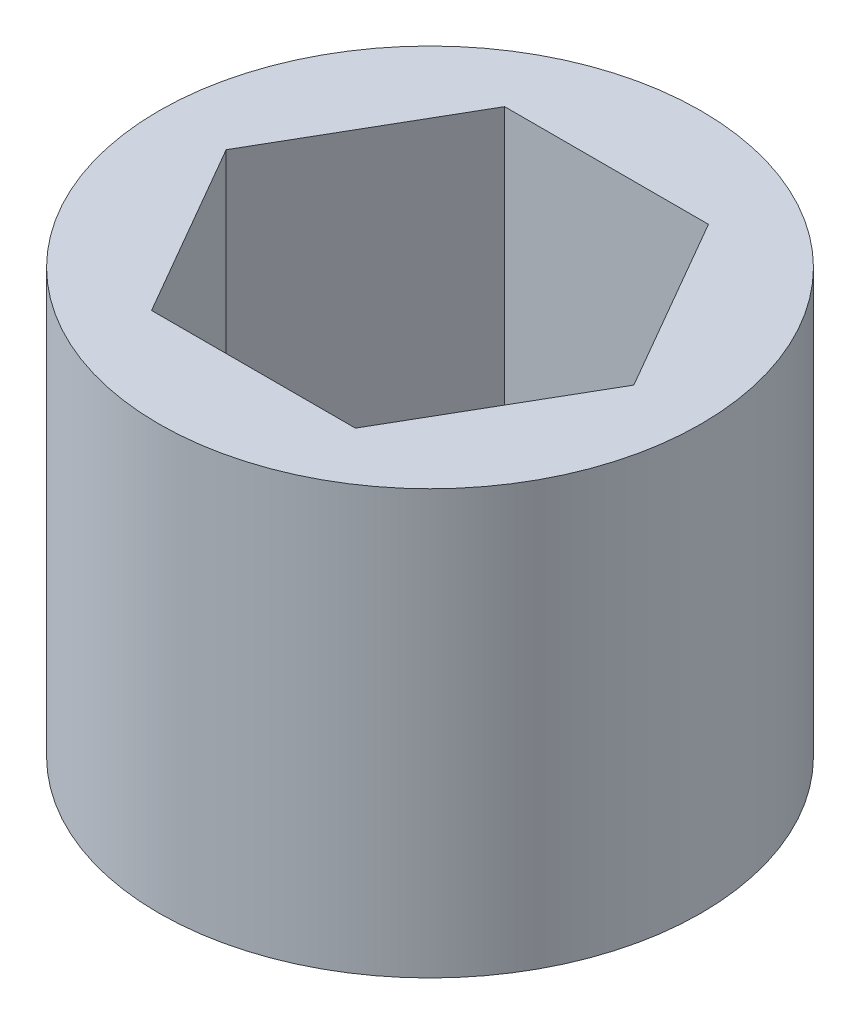
ISO-10303-21;
HEADER;
FILE_DESCRIPTION(('STEP AP214'),'2;1');
FILE_NAME('part.step','',(''),(''),'','','');
FILE_SCHEMA(('AUTOMOTIVE_DESIGN { 1 0 10303 214 1 1 1 1 }'));
ENDSEC;
DATA;
#1=APPLICATION_CONTEXT('core data for automotive mechanical design processes');
#2=APPLICATION_PROTOCOL_DEFINITION('international standard','automotive_design',2000,#1);
#3=PRODUCT_CONTEXT('',#1,'mechanical');
#4=PRODUCT('Part','Part','',(#3));
#5=PRODUCT_RELATED_PRODUCT_CATEGORY('part','',(#4));
#6=PRODUCT_DEFINITION_FORMATION('','',#4);
#7=PRODUCT_DEFINITION_CONTEXT('part definition',#1,'design');
#8=PRODUCT_DEFINITION('design','',#6,#7);
#9=PRODUCT_DEFINITION_SHAPE('','',#8);
#10=(LENGTH_UNIT() NAMED_UNIT(*) SI_UNIT(.MILLI.,.METRE.));
#11=(NAMED_UNIT(*) PLANE_ANGLE_UNIT() SI_UNIT($,.RADIAN.));
#12=(NAMED_UNIT(*) SI_UNIT($,.STERADIAN.) SOLID_ANGLE_UNIT());
#13=UNCERTAINTY_MEASURE_WITH_UNIT(LENGTH_MEASURE(1.E-05),#10,'distance_accuracy_value','');
#14=(GEOMETRIC_REPRESENTATION_CONTEXT(3) GLOBAL_UNCERTAINTY_ASSIGNED_CONTEXT((#13)) GLOBAL_UNIT_ASSIGNED_CONTEXT((#10,
#11,#12)) REPRESENTATION_CONTEXT('',''));
#15=CARTESIAN_POINT('',(0.,0.,0.));
#16=DIRECTION('',(0.,0.,1.));
#17=DIRECTION('',(1.,0.,0.));
#18=AXIS2_PLACEMENT_3D('',#15,#16,#17);
#19=CARTESIAN_POINT('',(0.,15.24,0.));
#20=DIRECTION('',(0.,1.,0.));
#21=DIRECTION('',(0.,0.,1.));
#22=AXIS2_PLACEMENT_3D('',#19,#20,#21);
#23=PLANE('',#22);
#24=CARTESIAN_POINT('',(0.,15.24,0.));
#25=DIRECTION('',(0.,1.,0.));
#26=DIRECTION('',(0.,0.,1.));
#27=AXIS2_PLACEMENT_3D('',#24,#25,#26);
#28=CIRCLE('',#27,9.7536);
#29=CARTESIAN_POINT('',(0.,15.24,-9.7536));
#30=VERTEX_POINT('',#29);
#31=EDGE_CURVE('E11',#30,#30,#28,.T.);
#32=ORIENTED_EDGE('',*,*,#31,.T.);
#33=EDGE_LOOP('',(#32));
#34=FACE_BOUND('',#33,.T.);
#35=DIRECTION('',(-0.5,0.,0.866025403784439));
#36=VECTOR('',#35,1.);
#37=CARTESIAN_POINT('',(-3.66617420935412,15.24,-6.35));
#38=LINE('',#37,#36);
#39=CARTESIAN_POINT('',(-3.66617420935412,15.24,-6.35));
#40=VERTEX_POINT('',#39);
#41=CARTESIAN_POINT('',(-7.33234841870825,15.24,0.));
#42=VERTEX_POINT('',#41);
#43=EDGE_CURVE('E96',#40,#42,#38,.T.);
#44=ORIENTED_EDGE('',*,*,#43,.F.);
#45=DIRECTION('',(-1.,0.,0.));
#46=VECTOR('',#45,1.);
#47=CARTESIAN_POINT('',(3.66617420935412,15.24,-6.35));
#48=LINE('',#47,#46);
#49=CARTESIAN_POINT('',(3.66617420935412,15.24,-6.35));
#50=VERTEX_POINT('',#49);
#51=EDGE_CURVE('E88',#50,#40,#48,.T.);
#52=ORIENTED_EDGE('',*,*,#51,.F.);
#53=DIRECTION('',(-0.5,0.,-0.866025403784438));
#54=VECTOR('',#53,1.);
#55=CARTESIAN_POINT('',(7.33234841870825,15.24,0.));
#56=LINE('',#55,#54);
#57=CARTESIAN_POINT('',(7.33234841870825,15.24,0.));
#58=VERTEX_POINT('',#57);
#59=EDGE_CURVE('E116',#58,#50,#56,.T.);
#60=ORIENTED_EDGE('',*,*,#59,.F.);
#61=DIRECTION('',(0.5,0.,-0.866025403784439));
#62=VECTOR('',#61,1.);
#63=CARTESIAN_POINT('',(3.66617420935413,15.24,6.35));
#64=LINE('',#63,#62);
#65=CARTESIAN_POINT('',(3.66617420935413,15.24,6.35));
#66=VERTEX_POINT('',#65);
#67=EDGE_CURVE('E114',#66,#58,#64,.T.);
#68=ORIENTED_EDGE('',*,*,#67,.F.);
#69=DIRECTION('',(1.,0.,0.));
#70=VECTOR('',#69,1.);
#71=CARTESIAN_POINT('',(-3.66617420935412,15.24,6.35));
#72=LINE('',#71,#70);
#73=CARTESIAN_POINT('',(-3.66617420935412,15.24,6.35));
#74=VERTEX_POINT('',#73);
#75=EDGE_CURVE('E110',#74,#66,#72,.T.);
#76=ORIENTED_EDGE('',*,*,#75,.F.);
#77=DIRECTION('',(0.5,0.,0.866025403784438));
#78=VECTOR('',#77,1.);
#79=CARTESIAN_POINT('',(-7.33234841870825,15.24,0.));
#80=LINE('',#79,#78);
#81=EDGE_CURVE('E108',#42,#74,#80,.T.);
#82=ORIENTED_EDGE('',*,*,#81,.F.);
#83=EDGE_LOOP('',(#44,#52,#60,#68,#76,#82));
#84=FACE_BOUND('',#83,.T.);
#85=ADVANCED_FACE('F35',(#34,#84),#23,.T.);
#86=CARTESIAN_POINT('',(0.,0.,0.));
#87=DIRECTION('',(0.,1.,0.));
#88=DIRECTION('',(0.,0.,1.));
#89=AXIS2_PLACEMENT_3D('',#86,#87,#88);
#90=PLANE('',#89);
#91=CARTESIAN_POINT('',(0.,0.,0.));
#92=DIRECTION('',(0.,1.,0.));
#93=DIRECTION('',(0.,0.,1.));
#94=AXIS2_PLACEMENT_3D('',#91,#92,#93);
#95=CIRCLE('',#94,9.7536);
#96=CARTESIAN_POINT('',(0.,0.,-9.7536));
#97=VERTEX_POINT('',#96);
#98=EDGE_CURVE('E39',#97,#97,#95,.T.);
#99=ORIENTED_EDGE('',*,*,#98,.F.);
#100=EDGE_LOOP('',(#99));
#101=FACE_BOUND('',#100,.T.);
#102=DIRECTION('',(-1.,0.,0.));
#103=VECTOR('',#102,1.);
#104=CARTESIAN_POINT('',(3.66617420935412,0.,-6.35));
#105=LINE('',#104,#103);
#106=CARTESIAN_POINT('',(3.66617420935412,0.,-6.35));
#107=VERTEX_POINT('',#106);
#108=CARTESIAN_POINT('',(-3.66617420935412,0.,-6.35));
#109=VERTEX_POINT('',#108);
#110=EDGE_CURVE('E58',#107,#109,#105,.T.);
#111=ORIENTED_EDGE('',*,*,#110,.T.);
#112=DIRECTION('',(-0.5,0.,0.866025403784439));
#113=VECTOR('',#112,1.);
#114=CARTESIAN_POINT('',(-3.66617420935412,0.,-6.35));
#115=LINE('',#114,#113);
#116=CARTESIAN_POINT('',(-7.33234841870825,0.,0.));
#117=VERTEX_POINT('',#116);
#118=EDGE_CURVE('E103',#109,#117,#115,.T.);
#119=ORIENTED_EDGE('',*,*,#118,.T.);
#120=DIRECTION('',(0.5,0.,0.866025403784438));
#121=VECTOR('',#120,1.);
#122=CARTESIAN_POINT('',(-7.33234841870825,0.,0.));
#123=LINE('',#122,#121);
#124=CARTESIAN_POINT('',(-3.66617420935412,0.,6.35));
#125=VERTEX_POINT('',#124);
#126=EDGE_CURVE('E120',#117,#125,#123,.T.);
#127=ORIENTED_EDGE('',*,*,#126,.T.);
#128=DIRECTION('',(1.,0.,0.));
#129=VECTOR('',#128,1.);
#130=CARTESIAN_POINT('',(-3.66617420935412,0.,6.35));
#131=LINE('',#130,#129);
#132=CARTESIAN_POINT('',(3.66617420935413,0.,6.35));
#133=VERTEX_POINT('',#132);
#134=EDGE_CURVE('E123',#125,#133,#131,.T.);
#135=ORIENTED_EDGE('',*,*,#134,.T.);
#136=DIRECTION('',(0.5,0.,-0.866025403784439));
#137=VECTOR('',#136,1.);
#138=CARTESIAN_POINT('',(3.66617420935413,0.,6.35));
#139=LINE('',#138,#137);
#140=CARTESIAN_POINT('',(7.33234841870825,0.,0.));
#141=VERTEX_POINT('',#140);
#142=EDGE_CURVE('E126',#133,#141,#139,.T.);
#143=ORIENTED_EDGE('',*,*,#142,.T.);
#144=DIRECTION('',(-0.5,0.,-0.866025403784438));
#145=VECTOR('',#144,1.);
#146=CARTESIAN_POINT('',(7.33234841870825,0.,0.));
#147=LINE('',#146,#145);
#148=EDGE_CURVE('E97',#141,#107,#147,.T.);
#149=ORIENTED_EDGE('',*,*,#148,.T.);
#150=EDGE_LOOP('',(#111,#119,#127,#135,#143,#149));
#151=FACE_BOUND('',#150,.T.);
#152=ADVANCED_FACE('F143',(#101,#151),#90,.F.);
#153=CARTESIAN_POINT('',(0.,15.24,0.));
#154=DIRECTION('',(0.,-1.,0.));
#155=DIRECTION('',(0.,0.,-1.));
#156=AXIS2_PLACEMENT_3D('',#153,#154,#155);
#157=CYLINDRICAL_SURFACE('',#156,9.7536);
#158=CARTESIAN_POINT('',(0.,15.24,-9.7536));
#159=CARTESIAN_POINT('',(0.,15.08125,-9.7536));
#160=CARTESIAN_POINT('',(0.,14.9225,-9.7536));
#161=CARTESIAN_POINT('',(0.,14.605,-9.7536));
#162=CARTESIAN_POINT('',(0.,14.44625,-9.7536));
#163=CARTESIAN_POINT('',(0.,14.12875,-9.7536));
#164=CARTESIAN_POINT('',(0.,13.97,-9.7536));
#165=CARTESIAN_POINT('',(0.,13.6525,-9.7536));
#166=CARTESIAN_POINT('',(0.,13.49375,-9.7536));
#167=CARTESIAN_POINT('',(0.,13.17625,-9.7536));
#168=CARTESIAN_POINT('',(0.,13.0175,-9.7536));
#169=CARTESIAN_POINT('',(0.,12.7,-9.7536));
#170=CARTESIAN_POINT('',(0.,12.54125,-9.7536));
#171=CARTESIAN_POINT('',(0.,12.22375,-9.7536));
#172=CARTESIAN_POINT('',(0.,12.065,-9.7536));
#173=CARTESIAN_POINT('',(0.,11.7475,-9.7536));
#174=CARTESIAN_POINT('',(0.,11.58875,-9.7536));
#175=CARTESIAN_POINT('',(0.,11.27125,-9.7536));
#176=CARTESIAN_POINT('',(0.,11.1125,-9.7536));
#177=CARTESIAN_POINT('',(0.,10.795,-9.7536));
#178=CARTESIAN_POINT('',(0.,10.63625,-9.7536));
#179=CARTESIAN_POINT('',(0.,10.31875,-9.7536));
#180=CARTESIAN_POINT('',(0.,10.16,-9.7536));
#181=CARTESIAN_POINT('',(0.,9.8425,-9.7536));
#182=CARTESIAN_POINT('',(0.,9.68375,-9.7536));
#183=CARTESIAN_POINT('',(0.,9.36625,-9.7536));
#184=CARTESIAN_POINT('',(0.,9.2075,-9.7536));
#185=CARTESIAN_POINT('',(0.,8.89,-9.7536));
#186=CARTESIAN_POINT('',(0.,8.73125,-9.7536));
#187=CARTESIAN_POINT('',(0.,8.41375,-9.7536));
#188=CARTESIAN_POINT('',(0.,8.255,-9.7536));
#189=CARTESIAN_POINT('',(0.,7.9375,-9.7536));
#190=CARTESIAN_POINT('',(0.,7.77875,-9.7536));
#191=CARTESIAN_POINT('',(0.,7.46125,-9.7536));
#192=CARTESIAN_POINT('',(0.,7.3025,-9.7536));
#193=CARTESIAN_POINT('',(0.,6.985,-9.7536));
#194=CARTESIAN_POINT('',(0.,6.82625,-9.7536));
#195=CARTESIAN_POINT('',(0.,6.50875,-9.7536));
#196=CARTESIAN_POINT('',(0.,6.35,-9.7536));
#197=CARTESIAN_POINT('',(0.,6.0325,-9.7536));
#198=CARTESIAN_POINT('',(0.,5.87375,-9.7536));
#199=CARTESIAN_POINT('',(0.,5.55625,-9.7536));
#200=CARTESIAN_POINT('',(0.,5.3975,-9.7536));
#201=CARTESIAN_POINT('',(0.,5.08,-9.7536));
#202=CARTESIAN_POINT('',(0.,4.92125,-9.7536));
#203=CARTESIAN_POINT('',(0.,4.60375,-9.7536));
#204=CARTESIAN_POINT('',(0.,4.445,-9.7536));
#205=CARTESIAN_POINT('',(0.,4.1275,-9.7536));
#206=CARTESIAN_POINT('',(0.,3.96875,-9.7536));
#207=CARTESIAN_POINT('',(0.,3.65125,-9.7536));
#208=CARTESIAN_POINT('',(0.,3.4925,-9.7536));
#209=CARTESIAN_POINT('',(0.,3.175,-9.7536));
#210=CARTESIAN_POINT('',(0.,3.01625,-9.7536));
#211=CARTESIAN_POINT('',(0.,2.69875,-9.7536));
#212=CARTESIAN_POINT('',(0.,2.54,-9.7536));
#213=CARTESIAN_POINT('',(0.,2.2225,-9.7536));
#214=CARTESIAN_POINT('',(0.,2.06375,-9.7536));
#215=CARTESIAN_POINT('',(0.,1.74625,-9.7536));
#216=CARTESIAN_POINT('',(0.,1.5875,-9.7536));
#217=CARTESIAN_POINT('',(0.,1.27,-9.7536));
#218=CARTESIAN_POINT('',(0.,1.11125,-9.7536));
#219=CARTESIAN_POINT('',(0.,0.79375,-9.7536));
#220=CARTESIAN_POINT('',(0.,0.634999999999999,-9.7536));
#221=CARTESIAN_POINT('',(0.,0.3175,-9.7536));
#222=CARTESIAN_POINT('',(0.,0.15875,-9.7536));
#223=CARTESIAN_POINT('',(0.,0.,-9.7536));
#224=B_SPLINE_CURVE_WITH_KNOTS('',3,(#158,#159,#160,#161,#162,#163,#164,#165,#166,#167,#168,
#169,#170,#171,#172,#173,#174,#175,#176,#177,#178,#179,#180,#181,#182,#183,#184,#185,#186,#187,
#188,#189,#190,#191,#192,#193,#194,#195,#196,#197,#198,#199,#200,#201,#202,#203,#204,#205,#206,
#207,#208,#209,#210,#211,#212,#213,#214,#215,#216,#217,#218,#219,#220,#221,#222,#223),
.UNSPECIFIED.,.F.,.F.,(4,2,2,2,2,2,2,2,2,2,2,2,2,2,2,2,2,2,2,2,2,2,2,2,2,2,2,2,2,2,2,2,4),(0.,
0.476249999999999,0.952499999999998,1.42875,1.905,2.38125,2.8575,3.33375,3.81,4.28625,4.7625,
5.23875,5.715,6.19125,6.6675,7.14375,7.62,8.09625,8.5725,9.04875,9.525,10.00125,10.4775,
10.95375,11.43,11.90625,12.3825,12.85875,13.335,13.81125,14.2875,14.76375,15.24),.UNSPECIFIED.);
#225=EDGE_CURVE('BSEAM37',#30,#97,#224,.T.);
#226=ORIENTED_EDGE('',*,*,#31,.F.);
#227=ORIENTED_EDGE('',*,*,#98,.T.);
#228=ORIENTED_EDGE('',*,*,#225,.T.);
#229=ORIENTED_EDGE('',*,*,#225,.F.);
#230=EDGE_LOOP('',(#226,#228,#227,#229));
#231=FACE_BOUND('',#230,.T.);
#232=ADVANCED_FACE('F37',(#231),#157,.T.);
#233=CARTESIAN_POINT('',(3.66617420935412,15.24,-6.35));
#234=DIRECTION('',(0.,0.,1.));
#235=DIRECTION('',(1.,0.,0.));
#236=AXIS2_PLACEMENT_3D('',#233,#234,#235);
#237=PLANE('',#236);
#238=ORIENTED_EDGE('',*,*,#110,.F.);
#239=DIRECTION('',(0.,-1.,0.));
#240=VECTOR('',#239,1.);
#241=CARTESIAN_POINT('',(3.66617420935412,15.24,-6.35));
#242=LINE('',#241,#240);
#243=EDGE_CURVE('E92',#50,#107,#242,.T.);
#244=ORIENTED_EDGE('',*,*,#243,.F.);
#245=ORIENTED_EDGE('',*,*,#51,.T.);
#246=DIRECTION('',(0.,-1.,0.));
#247=VECTOR('',#246,1.);
#248=CARTESIAN_POINT('',(-3.66617420935412,15.24,-6.35));
#249=LINE('',#248,#247);
#250=EDGE_CURVE('E91',#40,#109,#249,.T.);
#251=ORIENTED_EDGE('',*,*,#250,.T.);
#252=EDGE_LOOP('',(#238,#244,#245,#251));
#253=FACE_BOUND('',#252,.T.);
#254=ADVANCED_FACE('F90',(#253),#237,.T.);
#255=CARTESIAN_POINT('',(-3.66617420935412,15.24,-6.35));
#256=DIRECTION('',(0.866025403784439,0.,0.5));
#257=DIRECTION('',(0.5,0.,-0.866025403784439));
#258=AXIS2_PLACEMENT_3D('',#255,#256,#257);
#259=PLANE('',#258);
#260=ORIENTED_EDGE('',*,*,#118,.F.);
#261=ORIENTED_EDGE('',*,*,#250,.F.);
#262=ORIENTED_EDGE('',*,*,#43,.T.);
#263=DIRECTION('',(0.,-1.,0.));
#264=VECTOR('',#263,1.);
#265=CARTESIAN_POINT('',(-7.33234841870825,15.24,0.));
#266=LINE('',#265,#264);
#267=EDGE_CURVE('E104',#42,#117,#266,.T.);
#268=ORIENTED_EDGE('',*,*,#267,.T.);
#269=EDGE_LOOP('',(#260,#261,#262,#268));
#270=FACE_BOUND('',#269,.T.);
#271=ADVANCED_FACE('F100',(#270),#259,.T.);
#272=CARTESIAN_POINT('',(-7.33234841870825,15.24,0.));
#273=DIRECTION('',(0.866025403784438,0.,-0.5));
#274=DIRECTION('',(-0.5,0.,-0.866025403784438));
#275=AXIS2_PLACEMENT_3D('',#272,#273,#274);
#276=PLANE('',#275);
#277=ORIENTED_EDGE('',*,*,#126,.F.);
#278=ORIENTED_EDGE('',*,*,#267,.F.);
#279=ORIENTED_EDGE('',*,*,#81,.T.);
#280=DIRECTION('',(0.,-1.,0.));
#281=VECTOR('',#280,1.);
#282=CARTESIAN_POINT('',(-3.66617420935412,15.24,6.35));
#283=LINE('',#282,#281);
#284=EDGE_CURVE('E135',#74,#125,#283,.T.);
#285=ORIENTED_EDGE('',*,*,#284,.T.);
#286=EDGE_LOOP('',(#277,#278,#279,#285));
#287=FACE_BOUND('',#286,.T.);
#288=ADVANCED_FACE('F139',(#287),#276,.T.);
#289=CARTESIAN_POINT('',(-3.66617420935412,15.24,6.35));
#290=DIRECTION('',(0.,0.,-1.));
#291=DIRECTION('',(-1.,0.,0.));
#292=AXIS2_PLACEMENT_3D('',#289,#290,#291);
#293=PLANE('',#292);
#294=ORIENTED_EDGE('',*,*,#134,.F.);
#295=ORIENTED_EDGE('',*,*,#284,.F.);
#296=ORIENTED_EDGE('',*,*,#75,.T.);
#297=DIRECTION('',(0.,-1.,0.));
#298=VECTOR('',#297,1.);
#299=CARTESIAN_POINT('',(3.66617420935413,15.24,6.35));
#300=LINE('',#299,#298);
#301=EDGE_CURVE('E133',#66,#133,#300,.T.);
#302=ORIENTED_EDGE('',*,*,#301,.T.);
#303=EDGE_LOOP('',(#294,#295,#296,#302));
#304=FACE_BOUND('',#303,.T.);
#305=ADVANCED_FACE('F151',(#304),#293,.T.);
#306=CARTESIAN_POINT('',(3.66617420935413,15.24,6.35));
#307=DIRECTION('',(-0.866025403784439,0.,-0.5));
#308=DIRECTION('',(-0.5,0.,0.866025403784439));
#309=AXIS2_PLACEMENT_3D('',#306,#307,#308);
#310=PLANE('',#309);
#311=ORIENTED_EDGE('',*,*,#142,.F.);
#312=ORIENTED_EDGE('',*,*,#301,.F.);
#313=ORIENTED_EDGE('',*,*,#67,.T.);
#314=DIRECTION('',(0.,-1.,0.));
#315=VECTOR('',#314,1.);
#316=CARTESIAN_POINT('',(7.33234841870825,15.24,0.));
#317=LINE('',#316,#315);
#318=EDGE_CURVE('E50',#58,#141,#317,.T.);
#319=ORIENTED_EDGE('',*,*,#318,.T.);
#320=EDGE_LOOP('',(#311,#312,#313,#319));
#321=FACE_BOUND('',#320,.T.);
#322=ADVANCED_FACE('F149',(#321),#310,.T.);
#323=CARTESIAN_POINT('',(7.33234841870825,15.24,0.));
#324=DIRECTION('',(-0.866025403784438,0.,0.5));
#325=DIRECTION('',(0.5,0.,0.866025403784439));
#326=AXIS2_PLACEMENT_3D('',#323,#324,#325);
#327=PLANE('',#326);
#328=ORIENTED_EDGE('',*,*,#148,.F.);
#329=ORIENTED_EDGE('',*,*,#318,.F.);
#330=ORIENTED_EDGE('',*,*,#59,.T.);
#331=ORIENTED_EDGE('',*,*,#243,.T.);
#332=EDGE_LOOP('',(#328,#329,#330,#331));
#333=FACE_BOUND('',#332,.T.);
#334=ADVANCED_FACE('F145',(#333),#327,.T.);
#335=CLOSED_SHELL('',(#85,#152,#232,#254,#271,#288,#305,#322,#334));
#336=MANIFOLD_SOLID_BREP('B2',#335);
#337=ADVANCED_BREP_SHAPE_REPRESENTATION('',(#18,#336),#14);
#338=SHAPE_DEFINITION_REPRESENTATION(#9,#337);
ENDSEC;
END-ISO-10303-21;
